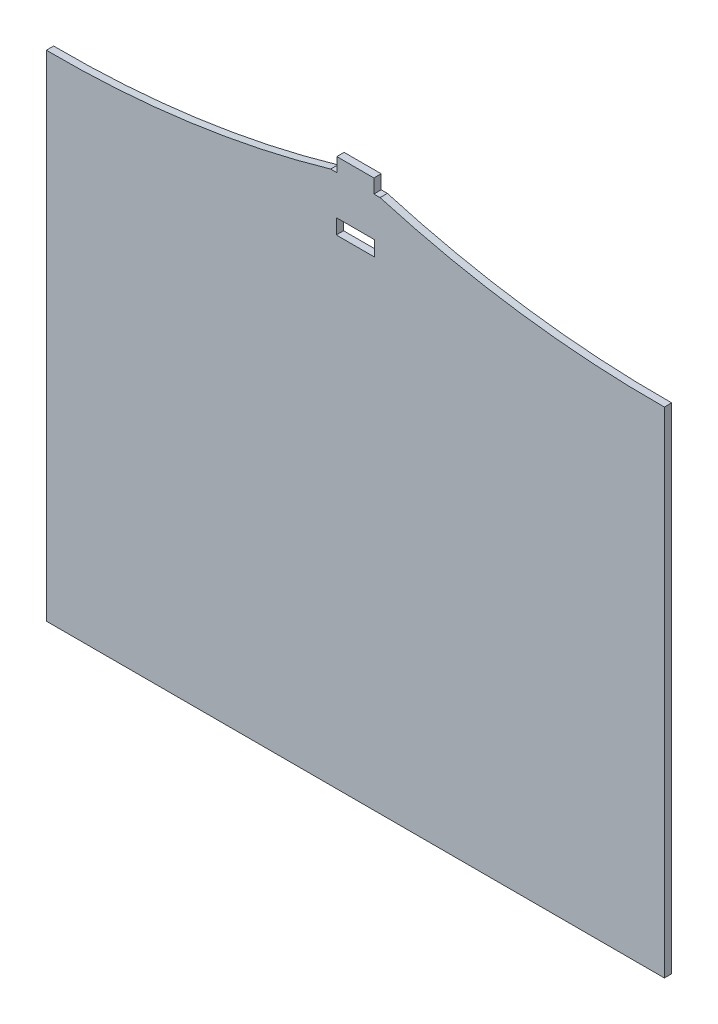
ISO-10303-21;
HEADER;
FILE_DESCRIPTION(('STEP AP214'),'2;1');
FILE_NAME('part.step','',(''),(''),'','','');
FILE_SCHEMA(('AUTOMOTIVE_DESIGN { 1 0 10303 214 1 1 1 1 }'));
ENDSEC;
DATA;
#1=APPLICATION_CONTEXT('core data for automotive mechanical design processes');
#2=APPLICATION_PROTOCOL_DEFINITION('international standard','automotive_design',2000,#1);
#3=PRODUCT_CONTEXT('',#1,'mechanical');
#4=PRODUCT('Part','Part','',(#3));
#5=PRODUCT_RELATED_PRODUCT_CATEGORY('part','',(#4));
#6=PRODUCT_DEFINITION_FORMATION('','',#4);
#7=PRODUCT_DEFINITION_CONTEXT('part definition',#1,'design');
#8=PRODUCT_DEFINITION('design','',#6,#7);
#9=PRODUCT_DEFINITION_SHAPE('','',#8);
#10=(LENGTH_UNIT() NAMED_UNIT(*) SI_UNIT(.MILLI.,.METRE.));
#11=(NAMED_UNIT(*) PLANE_ANGLE_UNIT() SI_UNIT($,.RADIAN.));
#12=(NAMED_UNIT(*) SI_UNIT($,.STERADIAN.) SOLID_ANGLE_UNIT());
#13=UNCERTAINTY_MEASURE_WITH_UNIT(LENGTH_MEASURE(1.E-05),#10,'distance_accuracy_value','');
#14=(GEOMETRIC_REPRESENTATION_CONTEXT(3) GLOBAL_UNCERTAINTY_ASSIGNED_CONTEXT((#13)) GLOBAL_UNIT_ASSIGNED_CONTEXT((#10,
#11,#12)) REPRESENTATION_CONTEXT('',''));
#15=CARTESIAN_POINT('',(0.,0.,0.));
#16=DIRECTION('',(0.,0.,1.));
#17=DIRECTION('',(1.,0.,0.));
#18=AXIS2_PLACEMENT_3D('',#15,#16,#17);
#19=CARTESIAN_POINT('',(-111.431811733447,453.585246871246,2.95));
#20=DIRECTION('',(0.,0.,1.));
#21=DIRECTION('',(1.,0.,0.));
#22=AXIS2_PLACEMENT_3D('',#19,#20,#21);
#23=PLANE('',#22);
#24=CARTESIAN_POINT('',(-111.431811733447,453.585246871246,2.95));
#25=DIRECTION('',(0.,0.,-1.));
#26=DIRECTION('',(1.,0.,0.));
#27=AXIS2_PLACEMENT_3D('',#24,#25,#26);
#28=CIRCLE('',#27,400.);
#29=CARTESIAN_POINT('',(0.171167623914634,69.4696718179025,2.95));
#30=VERTEX_POINT('',#29);
#31=CARTESIAN_POINT('',(-114.828832376085,53.5996718179025,2.95));
#32=VERTEX_POINT('',#31);
#33=EDGE_CURVE('E170',#30,#32,#28,.T.);
#34=ORIENTED_EDGE('',*,*,#33,.T.);
#35=DIRECTION('',(0.,-1.,0.));
#36=VECTOR('',#35,1.);
#37=CARTESIAN_POINT('',(-114.828832376085,53.5996718179025,2.95));
#38=LINE('',#37,#36);
#39=CARTESIAN_POINT('',(-114.828832376085,-146.400328182097,2.95));
#40=VERTEX_POINT('',#39);
#41=EDGE_CURVE('E173',#32,#40,#38,.T.);
#42=ORIENTED_EDGE('',*,*,#41,.T.);
#43=DIRECTION('',(1.,0.,0.));
#44=VECTOR('',#43,1.);
#45=CARTESIAN_POINT('',(-114.828832376085,-146.400328182097,2.95));
#46=LINE('',#45,#44);
#47=CARTESIAN_POINT('',(135.171167623915,-146.400328182097,2.95));
#48=VERTEX_POINT('',#47);
#49=EDGE_CURVE('E176',#40,#48,#46,.T.);
#50=ORIENTED_EDGE('',*,*,#49,.T.);
#51=DIRECTION('',(0.,1.,0.));
#52=VECTOR('',#51,1.);
#53=CARTESIAN_POINT('',(135.171167623915,53.5996718179025,2.95));
#54=LINE('',#53,#52);
#55=CARTESIAN_POINT('',(135.171167623915,53.5996718179025,2.95));
#56=VERTEX_POINT('',#55);
#57=EDGE_CURVE('E178',#48,#56,#54,.T.);
#58=ORIENTED_EDGE('',*,*,#57,.T.);
#59=CARTESIAN_POINT('',(131.774146981276,453.585246871246,2.95));
#60=DIRECTION('',(0.,0.,-1.));
#61=DIRECTION('',(1.,0.,0.));
#62=AXIS2_PLACEMENT_3D('',#59,#60,#61);
#63=CIRCLE('',#62,400.);
#64=CARTESIAN_POINT('',(20.1711676239147,69.4696718179025,2.95));
#65=VERTEX_POINT('',#64);
#66=EDGE_CURVE('E180',#56,#65,#63,.T.);
#67=ORIENTED_EDGE('',*,*,#66,.T.);
#68=DIRECTION('',(-1.,0.,0.));
#69=VECTOR('',#68,1.);
#70=CARTESIAN_POINT('',(17.6711676239146,69.4696718179025,2.95));
#71=LINE('',#70,#69);
#72=CARTESIAN_POINT('',(17.6711676239146,69.4696718179025,2.95));
#73=VERTEX_POINT('',#72);
#74=EDGE_CURVE('E182',#65,#73,#71,.T.);
#75=ORIENTED_EDGE('',*,*,#74,.T.);
#76=DIRECTION('',(0.,1.,0.));
#77=VECTOR('',#76,1.);
#78=CARTESIAN_POINT('',(17.6711676239146,69.4696718179025,2.95));
#79=LINE('',#78,#77);
#80=CARTESIAN_POINT('',(17.6711676239146,75.0996718179025,2.95));
#81=VERTEX_POINT('',#80);
#82=EDGE_CURVE('E184',#73,#81,#79,.T.);
#83=ORIENTED_EDGE('',*,*,#82,.T.);
#84=DIRECTION('',(-1.,0.,0.));
#85=VECTOR('',#84,1.);
#86=CARTESIAN_POINT('',(2.67116762391463,75.0996718179025,2.95));
#87=LINE('',#86,#85);
#88=CARTESIAN_POINT('',(2.67116762391463,75.0996718179025,2.95));
#89=VERTEX_POINT('',#88);
#90=EDGE_CURVE('E186',#81,#89,#87,.T.);
#91=ORIENTED_EDGE('',*,*,#90,.T.);
#92=DIRECTION('',(0.,-1.,0.));
#93=VECTOR('',#92,1.);
#94=CARTESIAN_POINT('',(2.67116762391463,69.4696718179025,2.95));
#95=LINE('',#94,#93);
#96=CARTESIAN_POINT('',(2.67116762391463,69.4696718179025,2.95));
#97=VERTEX_POINT('',#96);
#98=EDGE_CURVE('E188',#89,#97,#95,.T.);
#99=ORIENTED_EDGE('',*,*,#98,.T.);
#100=DIRECTION('',(-1.,0.,0.));
#101=VECTOR('',#100,1.);
#102=CARTESIAN_POINT('',(0.171167623914634,69.4696718179025,2.95));
#103=LINE('',#102,#101);
#104=EDGE_CURVE('E190',#97,#30,#103,.T.);
#105=ORIENTED_EDGE('',*,*,#104,.T.);
#106=EDGE_LOOP('',(#34,#42,#50,#58,#67,#75,#83,#91,#99,#105));
#107=FACE_BOUND('',#106,.T.);
#108=DIRECTION('',(1.,0.,0.));
#109=VECTOR('',#108,1.);
#110=CARTESIAN_POINT('',(2.44616762391457,47.5196718179025,2.95));
#111=LINE('',#110,#109);
#112=CARTESIAN_POINT('',(2.44616762391457,47.5196718179025,2.95));
#113=VERTEX_POINT('',#112);
#114=CARTESIAN_POINT('',(17.8961676239146,47.5196718179025,2.95));
#115=VERTEX_POINT('',#114);
#116=EDGE_CURVE('E142',#113,#115,#111,.T.);
#117=ORIENTED_EDGE('',*,*,#116,.F.);
#118=DIRECTION('',(0.,-1.,0.));
#119=VECTOR('',#118,1.);
#120=CARTESIAN_POINT('',(2.44616762391457,53.5996718179025,2.95));
#121=LINE('',#120,#119);
#122=CARTESIAN_POINT('',(2.44616762391457,53.5996718179025,2.95));
#123=VERTEX_POINT('',#122);
#124=EDGE_CURVE('E134',#123,#113,#121,.T.);
#125=ORIENTED_EDGE('',*,*,#124,.F.);
#126=DIRECTION('',(-1.,0.,0.));
#127=VECTOR('',#126,1.);
#128=CARTESIAN_POINT('',(2.44616762391457,53.5996718179025,2.95));
#129=LINE('',#128,#127);
#130=CARTESIAN_POINT('',(17.8961676239146,53.5996718179025,2.95));
#131=VERTEX_POINT('',#130);
#132=EDGE_CURVE('E156',#131,#123,#129,.T.);
#133=ORIENTED_EDGE('',*,*,#132,.F.);
#134=DIRECTION('',(0.,1.,0.));
#135=VECTOR('',#134,1.);
#136=CARTESIAN_POINT('',(17.8961676239146,53.5996718179025,2.95));
#137=LINE('',#136,#135);
#138=EDGE_CURVE('E154',#115,#131,#137,.T.);
#139=ORIENTED_EDGE('',*,*,#138,.F.);
#140=EDGE_LOOP('',(#117,#125,#133,#139));
#141=FACE_BOUND('',#140,.T.);
#142=ADVANCED_FACE('F33',(#107,#141),#23,.T.);
#143=CARTESIAN_POINT('',(-111.431811733447,453.585246871246,0.));
#144=DIRECTION('',(0.,0.,1.));
#145=DIRECTION('',(1.,0.,0.));
#146=AXIS2_PLACEMENT_3D('',#143,#144,#145);
#147=PLANE('',#146);
#148=CARTESIAN_POINT('',(-111.431811733447,453.585246871246,0.));
#149=DIRECTION('',(0.,0.,-1.));
#150=DIRECTION('',(1.,0.,0.));
#151=AXIS2_PLACEMENT_3D('',#148,#149,#150);
#152=CIRCLE('',#151,400.);
#153=CARTESIAN_POINT('',(0.171167623914634,69.4696718179025,0.));
#154=VERTEX_POINT('',#153);
#155=CARTESIAN_POINT('',(-114.828832376085,53.5996718179025,0.));
#156=VERTEX_POINT('',#155);
#157=EDGE_CURVE('E150',#154,#156,#152,.T.);
#158=ORIENTED_EDGE('',*,*,#157,.F.);
#159=DIRECTION('',(-1.,0.,0.));
#160=VECTOR('',#159,1.);
#161=CARTESIAN_POINT('',(0.171167623914634,69.4696718179025,0.));
#162=LINE('',#161,#160);
#163=CARTESIAN_POINT('',(2.67116762391463,69.4696718179025,0.));
#164=VERTEX_POINT('',#163);
#165=EDGE_CURVE('E174',#164,#154,#162,.T.);
#166=ORIENTED_EDGE('',*,*,#165,.F.);
#167=DIRECTION('',(0.,-1.,0.));
#168=VECTOR('',#167,1.);
#169=CARTESIAN_POINT('',(2.67116762391463,69.4696718179025,0.));
#170=LINE('',#169,#168);
#171=CARTESIAN_POINT('',(2.67116762391463,75.0996718179025,0.));
#172=VERTEX_POINT('',#171);
#173=EDGE_CURVE('E209',#172,#164,#170,.T.);
#174=ORIENTED_EDGE('',*,*,#173,.F.);
#175=DIRECTION('',(-1.,0.,0.));
#176=VECTOR('',#175,1.);
#177=CARTESIAN_POINT('',(2.67116762391463,75.0996718179025,0.));
#178=LINE('',#177,#176);
#179=CARTESIAN_POINT('',(17.6711676239146,75.0996718179025,0.));
#180=VERTEX_POINT('',#179);
#181=EDGE_CURVE('E207',#180,#172,#178,.T.);
#182=ORIENTED_EDGE('',*,*,#181,.F.);
#183=DIRECTION('',(0.,1.,0.));
#184=VECTOR('',#183,1.);
#185=CARTESIAN_POINT('',(17.6711676239146,69.4696718179025,0.));
#186=LINE('',#185,#184);
#187=CARTESIAN_POINT('',(17.6711676239146,69.4696718179025,0.));
#188=VERTEX_POINT('',#187);
#189=EDGE_CURVE('E205',#188,#180,#186,.T.);
#190=ORIENTED_EDGE('',*,*,#189,.F.);
#191=DIRECTION('',(-1.,0.,0.));
#192=VECTOR('',#191,1.);
#193=CARTESIAN_POINT('',(17.6711676239146,69.4696718179025,0.));
#194=LINE('',#193,#192);
#195=CARTESIAN_POINT('',(20.1711676239147,69.4696718179025,0.));
#196=VERTEX_POINT('',#195);
#197=EDGE_CURVE('E203',#196,#188,#194,.T.);
#198=ORIENTED_EDGE('',*,*,#197,.F.);
#199=CARTESIAN_POINT('',(131.774146981276,453.585246871246,0.));
#200=DIRECTION('',(0.,0.,-1.));
#201=DIRECTION('',(1.,0.,0.));
#202=AXIS2_PLACEMENT_3D('',#199,#200,#201);
#203=CIRCLE('',#202,400.);
#204=CARTESIAN_POINT('',(135.171167623915,53.5996718179025,0.));
#205=VERTEX_POINT('',#204);
#206=EDGE_CURVE('E201',#205,#196,#203,.T.);
#207=ORIENTED_EDGE('',*,*,#206,.F.);
#208=DIRECTION('',(0.,1.,0.));
#209=VECTOR('',#208,1.);
#210=CARTESIAN_POINT('',(135.171167623915,53.5996718179025,0.));
#211=LINE('',#210,#209);
#212=CARTESIAN_POINT('',(135.171167623915,-146.400328182097,0.));
#213=VERTEX_POINT('',#212);
#214=EDGE_CURVE('E199',#213,#205,#211,.T.);
#215=ORIENTED_EDGE('',*,*,#214,.F.);
#216=DIRECTION('',(1.,0.,0.));
#217=VECTOR('',#216,1.);
#218=CARTESIAN_POINT('',(-114.828832376085,-146.400328182097,0.));
#219=LINE('',#218,#217);
#220=CARTESIAN_POINT('',(-114.828832376085,-146.400328182097,0.));
#221=VERTEX_POINT('',#220);
#222=EDGE_CURVE('E197',#221,#213,#219,.T.);
#223=ORIENTED_EDGE('',*,*,#222,.F.);
#224=DIRECTION('',(0.,-1.,0.));
#225=VECTOR('',#224,1.);
#226=CARTESIAN_POINT('',(-114.828832376085,53.5996718179025,0.));
#227=LINE('',#226,#225);
#228=EDGE_CURVE('E195',#156,#221,#227,.T.);
#229=ORIENTED_EDGE('',*,*,#228,.F.);
#230=EDGE_LOOP('',(#158,#166,#174,#182,#190,#198,#207,#215,#223,#229));
#231=FACE_BOUND('',#230,.T.);
#232=DIRECTION('',(0.,-1.,0.));
#233=VECTOR('',#232,1.);
#234=CARTESIAN_POINT('',(2.44616762391457,53.5996718179025,0.));
#235=LINE('',#234,#233);
#236=CARTESIAN_POINT('',(2.44616762391457,53.5996718179025,0.));
#237=VERTEX_POINT('',#236);
#238=CARTESIAN_POINT('',(2.44616762391457,47.5196718179025,0.));
#239=VERTEX_POINT('',#238);
#240=EDGE_CURVE('E56',#237,#239,#235,.T.);
#241=ORIENTED_EDGE('',*,*,#240,.T.);
#242=DIRECTION('',(1.,0.,0.));
#243=VECTOR('',#242,1.);
#244=CARTESIAN_POINT('',(2.44616762391457,47.5196718179025,0.));
#245=LINE('',#244,#243);
#246=CARTESIAN_POINT('',(17.8961676239146,47.5196718179025,0.));
#247=VERTEX_POINT('',#246);
#248=EDGE_CURVE('E149',#239,#247,#245,.T.);
#249=ORIENTED_EDGE('',*,*,#248,.T.);
#250=DIRECTION('',(0.,1.,0.));
#251=VECTOR('',#250,1.);
#252=CARTESIAN_POINT('',(17.8961676239146,53.5996718179025,0.));
#253=LINE('',#252,#251);
#254=CARTESIAN_POINT('',(17.8961676239146,53.5996718179025,0.));
#255=VERTEX_POINT('',#254);
#256=EDGE_CURVE('E162',#247,#255,#253,.T.);
#257=ORIENTED_EDGE('',*,*,#256,.T.);
#258=DIRECTION('',(-1.,0.,0.));
#259=VECTOR('',#258,1.);
#260=CARTESIAN_POINT('',(2.44616762391457,53.5996718179025,0.));
#261=LINE('',#260,#259);
#262=EDGE_CURVE('E143',#255,#237,#261,.T.);
#263=ORIENTED_EDGE('',*,*,#262,.T.);
#264=EDGE_LOOP('',(#241,#249,#257,#263));
#265=FACE_BOUND('',#264,.T.);
#266=ADVANCED_FACE('F245',(#231,#265),#147,.F.);
#267=CARTESIAN_POINT('',(-111.431811733447,453.585246871246,2.95));
#268=DIRECTION('',(0.,0.,-1.));
#269=DIRECTION('',(-1.,0.,0.));
#270=AXIS2_PLACEMENT_3D('',#267,#268,#269);
#271=CYLINDRICAL_SURFACE('',#270,400.);
#272=ORIENTED_EDGE('',*,*,#157,.T.);
#273=DIRECTION('',(0.,0.,-1.));
#274=VECTOR('',#273,1.);
#275=CARTESIAN_POINT('',(-114.828832376085,53.5996718179025,2.95));
#276=LINE('',#275,#274);
#277=EDGE_CURVE('E11',#32,#156,#276,.T.);
#278=ORIENTED_EDGE('',*,*,#277,.F.);
#279=ORIENTED_EDGE('',*,*,#33,.F.);
#280=DIRECTION('',(0.,0.,-1.));
#281=VECTOR('',#280,1.);
#282=CARTESIAN_POINT('',(0.171167623914634,69.4696718179025,2.95));
#283=LINE('',#282,#281);
#284=EDGE_CURVE('E192',#30,#154,#283,.T.);
#285=ORIENTED_EDGE('',*,*,#284,.T.);
#286=EDGE_LOOP('',(#272,#278,#279,#285));
#287=FACE_BOUND('',#286,.T.);
#288=ADVANCED_FACE('F35',(#287),#271,.F.);
#289=CARTESIAN_POINT('',(-114.828832376085,53.5996718179025,2.95));
#290=DIRECTION('',(1.,0.,0.));
#291=DIRECTION('',(0.,1.,0.));
#292=AXIS2_PLACEMENT_3D('',#289,#290,#291);
#293=PLANE('',#292);
#294=ORIENTED_EDGE('',*,*,#228,.T.);
#295=DIRECTION('',(0.,0.,-1.));
#296=VECTOR('',#295,1.);
#297=CARTESIAN_POINT('',(-114.828832376085,-146.400328182097,2.95));
#298=LINE('',#297,#296);
#299=EDGE_CURVE('E41',#40,#221,#298,.T.);
#300=ORIENTED_EDGE('',*,*,#299,.F.);
#301=ORIENTED_EDGE('',*,*,#41,.F.);
#302=ORIENTED_EDGE('',*,*,#277,.T.);
#303=EDGE_LOOP('',(#294,#300,#301,#302));
#304=FACE_BOUND('',#303,.T.);
#305=ADVANCED_FACE('F262',(#304),#293,.F.);
#306=CARTESIAN_POINT('',(-114.828832376085,-146.400328182097,2.95));
#307=DIRECTION('',(0.,1.,0.));
#308=DIRECTION('',(0.,0.,1.));
#309=AXIS2_PLACEMENT_3D('',#306,#307,#308);
#310=PLANE('',#309);
#311=ORIENTED_EDGE('',*,*,#222,.T.);
#312=DIRECTION('',(0.,0.,-1.));
#313=VECTOR('',#312,1.);
#314=CARTESIAN_POINT('',(135.171167623915,-146.400328182097,2.95));
#315=LINE('',#314,#313);
#316=EDGE_CURVE('E232',#48,#213,#315,.T.);
#317=ORIENTED_EDGE('',*,*,#316,.F.);
#318=ORIENTED_EDGE('',*,*,#49,.F.);
#319=ORIENTED_EDGE('',*,*,#299,.T.);
#320=EDGE_LOOP('',(#311,#317,#318,#319));
#321=FACE_BOUND('',#320,.T.);
#322=ADVANCED_FACE('F239',(#321),#310,.F.);
#323=CARTESIAN_POINT('',(135.171167623915,53.5996718179025,2.95));
#324=DIRECTION('',(-1.,0.,0.));
#325=DIRECTION('',(0.,-1.,0.));
#326=AXIS2_PLACEMENT_3D('',#323,#324,#325);
#327=PLANE('',#326);
#328=ORIENTED_EDGE('',*,*,#214,.T.);
#329=DIRECTION('',(0.,0.,-1.));
#330=VECTOR('',#329,1.);
#331=CARTESIAN_POINT('',(135.171167623915,53.5996718179025,2.95));
#332=LINE('',#331,#330);
#333=EDGE_CURVE('E229',#56,#205,#332,.T.);
#334=ORIENTED_EDGE('',*,*,#333,.F.);
#335=ORIENTED_EDGE('',*,*,#57,.F.);
#336=ORIENTED_EDGE('',*,*,#316,.T.);
#337=EDGE_LOOP('',(#328,#334,#335,#336));
#338=FACE_BOUND('',#337,.T.);
#339=ADVANCED_FACE('F251',(#338),#327,.F.);
#340=CARTESIAN_POINT('',(131.774146981276,453.585246871246,2.95));
#341=DIRECTION('',(0.,0.,-1.));
#342=DIRECTION('',(-1.,0.,0.));
#343=AXIS2_PLACEMENT_3D('',#340,#341,#342);
#344=CYLINDRICAL_SURFACE('',#343,400.);
#345=ORIENTED_EDGE('',*,*,#206,.T.);
#346=DIRECTION('',(0.,0.,-1.));
#347=VECTOR('',#346,1.);
#348=CARTESIAN_POINT('',(20.1711676239147,69.4696718179025,2.95));
#349=LINE('',#348,#347);
#350=EDGE_CURVE('E226',#65,#196,#349,.T.);
#351=ORIENTED_EDGE('',*,*,#350,.F.);
#352=ORIENTED_EDGE('',*,*,#66,.F.);
#353=ORIENTED_EDGE('',*,*,#333,.T.);
#354=EDGE_LOOP('',(#345,#351,#352,#353));
#355=FACE_BOUND('',#354,.T.);
#356=ADVANCED_FACE('F255',(#355),#344,.F.);
#357=CARTESIAN_POINT('',(17.6711676239146,69.4696718179025,2.95));
#358=DIRECTION('',(0.,-1.,0.));
#359=DIRECTION('',(0.,0.,-1.));
#360=AXIS2_PLACEMENT_3D('',#357,#358,#359);
#361=PLANE('',#360);
#362=ORIENTED_EDGE('',*,*,#197,.T.);
#363=DIRECTION('',(0.,0.,-1.));
#364=VECTOR('',#363,1.);
#365=CARTESIAN_POINT('',(17.6711676239146,69.4696718179025,2.95));
#366=LINE('',#365,#364);
#367=EDGE_CURVE('E223',#73,#188,#366,.T.);
#368=ORIENTED_EDGE('',*,*,#367,.F.);
#369=ORIENTED_EDGE('',*,*,#74,.F.);
#370=ORIENTED_EDGE('',*,*,#350,.T.);
#371=EDGE_LOOP('',(#362,#368,#369,#370));
#372=FACE_BOUND('',#371,.T.);
#373=ADVANCED_FACE('F285',(#372),#361,.F.);
#374=CARTESIAN_POINT('',(17.6711676239146,69.4696718179025,2.95));
#375=DIRECTION('',(-1.,0.,0.));
#376=DIRECTION('',(0.,0.,1.));
#377=AXIS2_PLACEMENT_3D('',#374,#375,#376);
#378=PLANE('',#377);
#379=ORIENTED_EDGE('',*,*,#189,.T.);
#380=DIRECTION('',(0.,0.,-1.));
#381=VECTOR('',#380,1.);
#382=CARTESIAN_POINT('',(17.6711676239146,75.0996718179025,2.95));
#383=LINE('',#382,#381);
#384=EDGE_CURVE('E220',#81,#180,#383,.T.);
#385=ORIENTED_EDGE('',*,*,#384,.F.);
#386=ORIENTED_EDGE('',*,*,#82,.F.);
#387=ORIENTED_EDGE('',*,*,#367,.T.);
#388=EDGE_LOOP('',(#379,#385,#386,#387));
#389=FACE_BOUND('',#388,.T.);
#390=ADVANCED_FACE('F282',(#389),#378,.F.);
#391=CARTESIAN_POINT('',(2.67116762391463,75.0996718179025,2.95));
#392=DIRECTION('',(0.,-1.,0.));
#393=DIRECTION('',(0.,0.,-1.));
#394=AXIS2_PLACEMENT_3D('',#391,#392,#393);
#395=PLANE('',#394);
#396=ORIENTED_EDGE('',*,*,#181,.T.);
#397=DIRECTION('',(0.,0.,-1.));
#398=VECTOR('',#397,1.);
#399=CARTESIAN_POINT('',(2.67116762391463,75.0996718179025,2.95));
#400=LINE('',#399,#398);
#401=EDGE_CURVE('E217',#89,#172,#400,.T.);
#402=ORIENTED_EDGE('',*,*,#401,.F.);
#403=ORIENTED_EDGE('',*,*,#90,.F.);
#404=ORIENTED_EDGE('',*,*,#384,.T.);
#405=EDGE_LOOP('',(#396,#402,#403,#404));
#406=FACE_BOUND('',#405,.T.);
#407=ADVANCED_FACE('F278',(#406),#395,.F.);
#408=CARTESIAN_POINT('',(2.67116762391463,69.4696718179025,2.95));
#409=DIRECTION('',(1.,0.,0.));
#410=DIRECTION('',(0.,0.,-1.));
#411=AXIS2_PLACEMENT_3D('',#408,#409,#410);
#412=PLANE('',#411);
#413=ORIENTED_EDGE('',*,*,#173,.T.);
#414=DIRECTION('',(0.,0.,-1.));
#415=VECTOR('',#414,1.);
#416=CARTESIAN_POINT('',(2.67116762391463,69.4696718179025,2.95));
#417=LINE('',#416,#415);
#418=EDGE_CURVE('E214',#97,#164,#417,.T.);
#419=ORIENTED_EDGE('',*,*,#418,.F.);
#420=ORIENTED_EDGE('',*,*,#98,.F.);
#421=ORIENTED_EDGE('',*,*,#401,.T.);
#422=EDGE_LOOP('',(#413,#419,#420,#421));
#423=FACE_BOUND('',#422,.T.);
#424=ADVANCED_FACE('F274',(#423),#412,.F.);
#425=CARTESIAN_POINT('',(0.171167623914634,69.4696718179025,2.95));
#426=DIRECTION('',(0.,-1.,0.));
#427=DIRECTION('',(0.,0.,-1.));
#428=AXIS2_PLACEMENT_3D('',#425,#426,#427);
#429=PLANE('',#428);
#430=ORIENTED_EDGE('',*,*,#165,.T.);
#431=ORIENTED_EDGE('',*,*,#284,.F.);
#432=ORIENTED_EDGE('',*,*,#104,.F.);
#433=ORIENTED_EDGE('',*,*,#418,.T.);
#434=EDGE_LOOP('',(#430,#431,#432,#433));
#435=FACE_BOUND('',#434,.T.);
#436=ADVANCED_FACE('F269',(#435),#429,.F.);
#437=CARTESIAN_POINT('',(2.44616762391457,53.5996718179025,2.95));
#438=DIRECTION('',(1.,0.,0.));
#439=DIRECTION('',(0.,0.,-1.));
#440=AXIS2_PLACEMENT_3D('',#437,#438,#439);
#441=PLANE('',#440);
#442=ORIENTED_EDGE('',*,*,#240,.F.);
#443=DIRECTION('',(0.,0.,-1.));
#444=VECTOR('',#443,1.);
#445=CARTESIAN_POINT('',(2.44616762391457,53.5996718179025,2.95));
#446=LINE('',#445,#444);
#447=EDGE_CURVE('E138',#123,#237,#446,.T.);
#448=ORIENTED_EDGE('',*,*,#447,.F.);
#449=ORIENTED_EDGE('',*,*,#124,.T.);
#450=DIRECTION('',(0.,0.,-1.));
#451=VECTOR('',#450,1.);
#452=CARTESIAN_POINT('',(2.44616762391457,47.5196718179025,2.95));
#453=LINE('',#452,#451);
#454=EDGE_CURVE('E137',#113,#239,#453,.T.);
#455=ORIENTED_EDGE('',*,*,#454,.T.);
#456=EDGE_LOOP('',(#442,#448,#449,#455));
#457=FACE_BOUND('',#456,.T.);
#458=ADVANCED_FACE('F136',(#457),#441,.T.);
#459=CARTESIAN_POINT('',(2.44616762391457,47.5196718179025,2.95));
#460=DIRECTION('',(0.,1.,0.));
#461=DIRECTION('',(0.,0.,1.));
#462=AXIS2_PLACEMENT_3D('',#459,#460,#461);
#463=PLANE('',#462);
#464=ORIENTED_EDGE('',*,*,#248,.F.);
#465=ORIENTED_EDGE('',*,*,#454,.F.);
#466=ORIENTED_EDGE('',*,*,#116,.T.);
#467=DIRECTION('',(0.,0.,-1.));
#468=VECTOR('',#467,1.);
#469=CARTESIAN_POINT('',(17.8961676239146,47.5196718179025,2.95));
#470=LINE('',#469,#468);
#471=EDGE_CURVE('E151',#115,#247,#470,.T.);
#472=ORIENTED_EDGE('',*,*,#471,.T.);
#473=EDGE_LOOP('',(#464,#465,#466,#472));
#474=FACE_BOUND('',#473,.T.);
#475=ADVANCED_FACE('F146',(#474),#463,.T.);
#476=CARTESIAN_POINT('',(17.8961676239146,53.5996718179025,2.95));
#477=DIRECTION('',(-1.,0.,0.));
#478=DIRECTION('',(0.,-1.,0.));
#479=AXIS2_PLACEMENT_3D('',#476,#477,#478);
#480=PLANE('',#479);
#481=ORIENTED_EDGE('',*,*,#256,.F.);
#482=ORIENTED_EDGE('',*,*,#471,.F.);
#483=ORIENTED_EDGE('',*,*,#138,.T.);
#484=DIRECTION('',(0.,0.,-1.));
#485=VECTOR('',#484,1.);
#486=CARTESIAN_POINT('',(17.8961676239146,53.5996718179025,2.95));
#487=LINE('',#486,#485);
#488=EDGE_CURVE('E48',#131,#255,#487,.T.);
#489=ORIENTED_EDGE('',*,*,#488,.T.);
#490=EDGE_LOOP('',(#481,#482,#483,#489));
#491=FACE_BOUND('',#490,.T.);
#492=ADVANCED_FACE('F331',(#491),#480,.T.);
#493=CARTESIAN_POINT('',(2.44616762391457,53.5996718179025,2.95));
#494=DIRECTION('',(0.,-1.,0.));
#495=DIRECTION('',(0.,0.,-1.));
#496=AXIS2_PLACEMENT_3D('',#493,#494,#495);
#497=PLANE('',#496);
#498=ORIENTED_EDGE('',*,*,#262,.F.);
#499=ORIENTED_EDGE('',*,*,#488,.F.);
#500=ORIENTED_EDGE('',*,*,#132,.T.);
#501=ORIENTED_EDGE('',*,*,#447,.T.);
#502=EDGE_LOOP('',(#498,#499,#500,#501));
#503=FACE_BOUND('',#502,.T.);
#504=ADVANCED_FACE('F337',(#503),#497,.T.);
#505=CLOSED_SHELL('',(#142,#266,#288,#305,#322,#339,#356,#373,#390,#407,#424,#436,#458,#475,
#492,#504));
#506=MANIFOLD_SOLID_BREP('B2',#505);
#507=ADVANCED_BREP_SHAPE_REPRESENTATION('',(#18,#506),#14);
#508=SHAPE_DEFINITION_REPRESENTATION(#9,#507);
ENDSEC;
END-ISO-10303-21;
